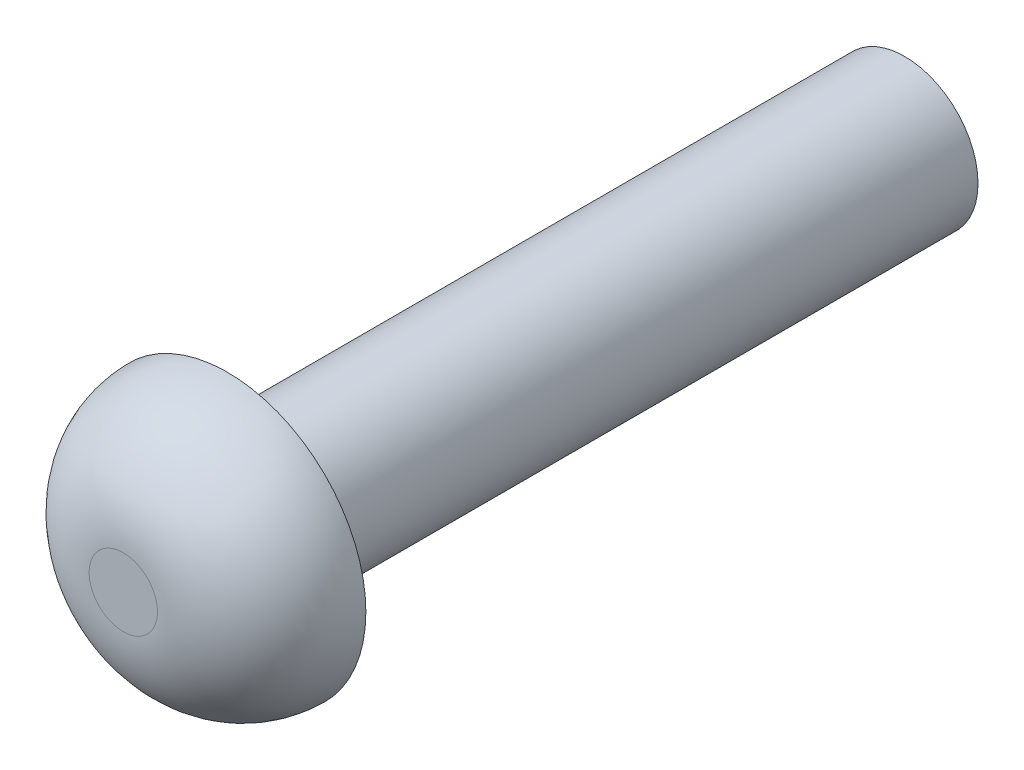
ISO-10303-21;
HEADER;
FILE_DESCRIPTION(('STEP AP214'),'2;1');
FILE_NAME('part.step','',(''),(''),'','','');
FILE_SCHEMA(('AUTOMOTIVE_DESIGN { 1 0 10303 214 1 1 1 1 }'));
ENDSEC;
DATA;
#1=APPLICATION_CONTEXT('core data for automotive mechanical design processes');
#2=APPLICATION_PROTOCOL_DEFINITION('international standard','automotive_design',2000,#1);
#3=PRODUCT_CONTEXT('',#1,'mechanical');
#4=PRODUCT('Part','Part','',(#3));
#5=PRODUCT_RELATED_PRODUCT_CATEGORY('part','',(#4));
#6=PRODUCT_DEFINITION_FORMATION('','',#4);
#7=PRODUCT_DEFINITION_CONTEXT('part definition',#1,'design');
#8=PRODUCT_DEFINITION('design','',#6,#7);
#9=PRODUCT_DEFINITION_SHAPE('','',#8);
#10=(LENGTH_UNIT() NAMED_UNIT(*) SI_UNIT(.MILLI.,.METRE.));
#11=(NAMED_UNIT(*) PLANE_ANGLE_UNIT() SI_UNIT($,.RADIAN.));
#12=(NAMED_UNIT(*) SI_UNIT($,.STERADIAN.) SOLID_ANGLE_UNIT());
#13=UNCERTAINTY_MEASURE_WITH_UNIT(LENGTH_MEASURE(1.E-05),#10,'distance_accuracy_value','');
#14=(GEOMETRIC_REPRESENTATION_CONTEXT(3) GLOBAL_UNCERTAINTY_ASSIGNED_CONTEXT((#13)) GLOBAL_UNIT_ASSIGNED_CONTEXT((#10,
#11,#12)) REPRESENTATION_CONTEXT('',''));
#15=CARTESIAN_POINT('',(0.,0.,0.));
#16=DIRECTION('',(0.,0.,1.));
#17=DIRECTION('',(1.,0.,0.));
#18=AXIS2_PLACEMENT_3D('',#15,#16,#17);
#19=CARTESIAN_POINT('',(0.,0.,12.));
#20=DIRECTION('',(0.,0.,-1.));
#21=DIRECTION('',(-1.,0.,0.));
#22=AXIS2_PLACEMENT_3D('',#19,#20,#21);
#23=CYLINDRICAL_SURFACE('',#22,1.125);
#24=CARTESIAN_POINT('',(0.,0.,0.));
#25=DIRECTION('',(0.,0.,1.));
#26=DIRECTION('',(1.,0.,0.));
#27=AXIS2_PLACEMENT_3D('',#24,#25,#26);
#28=CIRCLE('',#27,1.125);
#29=CARTESIAN_POINT('',(1.125,0.,0.));
#30=VERTEX_POINT('',#29);
#31=EDGE_CURVE('E42',#30,#30,#28,.T.);
#32=ORIENTED_EDGE('',*,*,#31,.T.);
#33=EDGE_LOOP('',(#32));
#34=FACE_BOUND('',#33,.T.);
#35=CARTESIAN_POINT('',(0.,0.,10.4));
#36=DIRECTION('',(0.,0.,1.));
#37=DIRECTION('',(1.,0.,0.));
#38=AXIS2_PLACEMENT_3D('',#35,#36,#37);
#39=CIRCLE('',#38,1.125);
#40=CARTESIAN_POINT('',(1.125,0.,10.4));
#41=VERTEX_POINT('',#40);
#42=EDGE_CURVE('E38',#41,#41,#39,.T.);
#43=ORIENTED_EDGE('',*,*,#42,.F.);
#44=EDGE_LOOP('',(#43));
#45=FACE_BOUND('',#44,.T.);
#46=ADVANCED_FACE('F31',(#34,#45),#23,.T.);
#47=CARTESIAN_POINT('',(0.,0.,0.));
#48=DIRECTION('',(0.,0.,1.));
#49=DIRECTION('',(1.,0.,0.));
#50=AXIS2_PLACEMENT_3D('',#47,#48,#49);
#51=PLANE('',#50);
#52=ORIENTED_EDGE('',*,*,#31,.F.);
#53=EDGE_LOOP('',(#52));
#54=FACE_BOUND('',#53,.T.);
#55=ADVANCED_FACE('F57',(#54),#51,.F.);
#56=CARTESIAN_POINT('',(0.,0.,10.4));
#57=DIRECTION('',(0.,0.,1.));
#58=DIRECTION('',(1.,0.,0.));
#59=AXIS2_PLACEMENT_3D('',#56,#57,#58);
#60=PLANE('',#59);
#61=ORIENTED_EDGE('',*,*,#42,.T.);
#62=EDGE_LOOP('',(#61));
#63=FACE_BOUND('',#62,.T.);
#64=CARTESIAN_POINT('',(0.,0.,10.4));
#65=DIRECTION('',(0.,0.,1.));
#66=DIRECTION('',(1.,0.,0.));
#67=AXIS2_PLACEMENT_3D('',#64,#65,#66);
#68=CIRCLE('',#67,2.125);
#69=CARTESIAN_POINT('',(2.125,0.,10.4));
#70=VERTEX_POINT('',#69);
#71=EDGE_CURVE('E46',#70,#70,#68,.T.);
#72=ORIENTED_EDGE('',*,*,#71,.F.);
#73=EDGE_LOOP('',(#72));
#74=FACE_BOUND('',#73,.T.);
#75=ADVANCED_FACE('F54',(#63,#74),#60,.F.);
#76=CARTESIAN_POINT('',(0.,0.,12.));
#77=DIRECTION('',(0.,0.,1.));
#78=DIRECTION('',(1.,0.,0.));
#79=AXIS2_PLACEMENT_3D('',#76,#77,#78);
#80=PLANE('',#79);
#81=CARTESIAN_POINT('',(0.,0.,12.));
#82=DIRECTION('',(0.,0.,1.));
#83=DIRECTION('',(1.,0.,0.));
#84=AXIS2_PLACEMENT_3D('',#81,#82,#83);
#85=CIRCLE('',#84,0.525);
#86=CARTESIAN_POINT('',(0.525,0.,12.));
#87=VERTEX_POINT('',#86);
#88=EDGE_CURVE('E10',#87,#87,#85,.T.);
#89=ORIENTED_EDGE('',*,*,#88,.T.);
#90=EDGE_LOOP('',(#89));
#91=FACE_BOUND('',#90,.T.);
#92=ADVANCED_FACE('F56',(#91),#80,.T.);
#93=CARTESIAN_POINT('',(0.,0.,10.4));
#94=DIRECTION('',(0.,0.,1.));
#95=DIRECTION('',(1.,0.,0.));
#96=AXIS2_PLACEMENT_3D('',#93,#94,#95);
#97=DEGENERATE_TOROIDAL_SURFACE('',#96,0.525,1.6,.T.);
#98=ORIENTED_EDGE('',*,*,#71,.T.);
#99=EDGE_LOOP('',(#98));
#100=FACE_BOUND('',#99,.T.);
#101=ORIENTED_EDGE('',*,*,#88,.F.);
#102=EDGE_LOOP('',(#101));
#103=FACE_BOUND('',#102,.T.);
#104=ADVANCED_FACE('F33',(#100,#103),#97,.T.);
#105=CLOSED_SHELL('',(#46,#55,#75,#92,#104));
#106=MANIFOLD_SOLID_BREP('B2',#105);
#107=ADVANCED_BREP_SHAPE_REPRESENTATION('',(#18,#106),#14);
#108=SHAPE_DEFINITION_REPRESENTATION(#9,#107);
ENDSEC;
END-ISO-10303-21;
